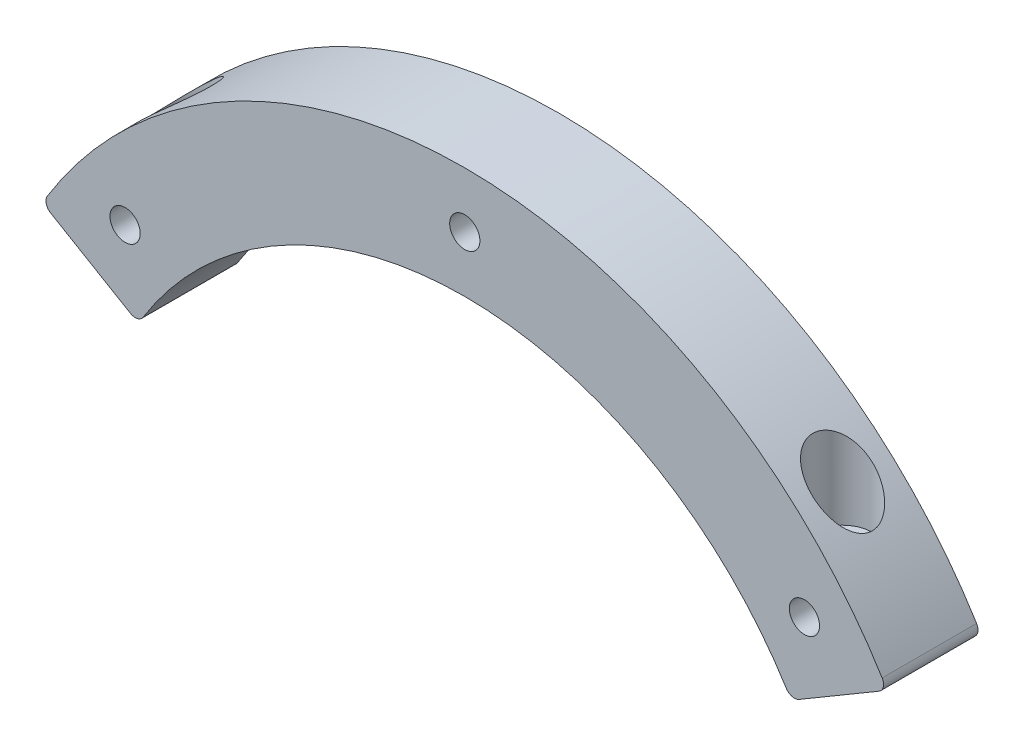
ISO-10303-21;
HEADER;
FILE_DESCRIPTION(('STEP AP214'),'2;1');
FILE_NAME('part.step','',(''),(''),'','','');
FILE_SCHEMA(('AUTOMOTIVE_DESIGN { 1 0 10303 214 1 1 1 1 }'));
ENDSEC;
DATA;
#1=APPLICATION_CONTEXT('core data for automotive mechanical design processes');
#2=APPLICATION_PROTOCOL_DEFINITION('international standard','automotive_design',2000,#1);
#3=PRODUCT_CONTEXT('',#1,'mechanical');
#4=PRODUCT('Part','Part','',(#3));
#5=PRODUCT_RELATED_PRODUCT_CATEGORY('part','',(#4));
#6=PRODUCT_DEFINITION_FORMATION('','',#4);
#7=PRODUCT_DEFINITION_CONTEXT('part definition',#1,'design');
#8=PRODUCT_DEFINITION('design','',#6,#7);
#9=PRODUCT_DEFINITION_SHAPE('','',#8);
#10=(LENGTH_UNIT() NAMED_UNIT(*) SI_UNIT(.MILLI.,.METRE.));
#11=(NAMED_UNIT(*) PLANE_ANGLE_UNIT() SI_UNIT($,.RADIAN.));
#12=(NAMED_UNIT(*) SI_UNIT($,.STERADIAN.) SOLID_ANGLE_UNIT());
#13=UNCERTAINTY_MEASURE_WITH_UNIT(LENGTH_MEASURE(1.E-05),#10,'distance_accuracy_value','');
#14=(GEOMETRIC_REPRESENTATION_CONTEXT(3) GLOBAL_UNCERTAINTY_ASSIGNED_CONTEXT((#13)) GLOBAL_UNIT_ASSIGNED_CONTEXT((#10,
#11,#12)) REPRESENTATION_CONTEXT('',''));
#15=CARTESIAN_POINT('',(0.,0.,0.));
#16=DIRECTION('',(0.,0.,1.));
#17=DIRECTION('',(1.,0.,0.));
#18=AXIS2_PLACEMENT_3D('',#15,#16,#17);
#19=CARTESIAN_POINT('',(0.,0.,10.));
#20=DIRECTION('',(0.,0.,-1.));
#21=DIRECTION('',(-1.,0.,0.));
#22=AXIS2_PLACEMENT_3D('',#19,#20,#21);
#23=CYLINDRICAL_SURFACE('',#22,40.1);
#24=CARTESIAN_POINT('',(0.,0.,0.));
#25=DIRECTION('',(0.,0.,-1.));
#26=DIRECTION('',(1.,0.,0.));
#27=AXIS2_PLACEMENT_3D('',#24,#25,#26);
#28=CIRCLE('',#27,40.1);
#29=CARTESIAN_POINT('',(-34.0459112545026,21.1869282070464,0.));
#30=VERTEX_POINT('',#29);
#31=CARTESIAN_POINT('',(34.0459112545025,21.1869282070464,0.));
#32=VERTEX_POINT('',#31);
#33=EDGE_CURVE('E141',#30,#32,#28,.T.);
#34=ORIENTED_EDGE('',*,*,#33,.T.);
#35=DIRECTION('',(0.,0.,-1.));
#36=VECTOR('',#35,1.);
#37=CARTESIAN_POINT('',(34.0459112545025,21.1869282070464,10.));
#38=LINE('',#37,#36);
#39=CARTESIAN_POINT('',(34.0459112545025,21.1869282070464,10.));
#40=VERTEX_POINT('',#39);
#41=EDGE_CURVE('E167',#32,#40,#38,.F.);
#42=ORIENTED_EDGE('',*,*,#41,.T.);
#43=CARTESIAN_POINT('',(0.,0.,10.));
#44=DIRECTION('',(0.,0.,-1.));
#45=DIRECTION('',(1.,0.,0.));
#46=AXIS2_PLACEMENT_3D('',#43,#44,#45);
#47=CIRCLE('',#46,40.1);
#48=CARTESIAN_POINT('',(-34.0459112545026,21.1869282070464,10.));
#49=VERTEX_POINT('',#48);
#50=EDGE_CURVE('E143',#49,#40,#47,.T.);
#51=ORIENTED_EDGE('',*,*,#50,.F.);
#52=DIRECTION('',(0.,0.,-1.));
#53=VECTOR('',#52,1.);
#54=CARTESIAN_POINT('',(-34.0459112545026,21.1869282070464,10.));
#55=LINE('',#54,#53);
#56=EDGE_CURVE('E162',#49,#30,#55,.T.);
#57=ORIENTED_EDGE('',*,*,#56,.T.);
#58=EDGE_LOOP('',(#34,#42,#51,#57));
#59=FACE_BOUND('',#58,.T.);
#60=ADVANCED_FACE('F41',(#59),#23,.F.);
#61=CARTESIAN_POINT('',(34.5513293337052,20.3522883547242,10.));
#62=DIRECTION('',(-0.507538362960701,0.861629160441527,0.));
#63=DIRECTION('',(-0.861629160441527,-0.507538362960701,0.));
#64=AXIS2_PLACEMENT_3D('',#61,#62,#63);
#65=PLANE('',#64);
#66=DIRECTION('',(0.861629160441527,0.507538362960701,0.));
#67=VECTOR('',#66,1.);
#68=CARTESIAN_POINT('',(34.5513293337052,20.3522883547242,0.));
#69=LINE('',#68,#67);
#70=CARTESIAN_POINT('',(35.40247483578,20.8536513709701,0.));
#71=VERTEX_POINT('',#70);
#72=CARTESIAN_POINT('',(43.8484595089165,25.8287165514455,0.));
#73=VERTEX_POINT('',#72);
#74=EDGE_CURVE('E139',#71,#73,#69,.T.);
#75=ORIENTED_EDGE('',*,*,#74,.T.);
#76=DIRECTION('',(0.,0.,-1.));
#77=VECTOR('',#76,1.);
#78=CARTESIAN_POINT('',(43.8484595089165,25.8287165514455,10.));
#79=LINE('',#78,#77);
#80=CARTESIAN_POINT('',(43.8484595089165,25.8287165514455,10.));
#81=VERTEX_POINT('',#80);
#82=EDGE_CURVE('E120',#73,#81,#79,.F.);
#83=ORIENTED_EDGE('',*,*,#82,.T.);
#84=DIRECTION('',(0.861629160441527,0.507538362960701,0.));
#85=VECTOR('',#84,1.);
#86=CARTESIAN_POINT('',(34.5513293337052,20.3522883547242,10.));
#87=LINE('',#86,#85);
#88=CARTESIAN_POINT('',(35.40247483578,20.8536513709701,10.));
#89=VERTEX_POINT('',#88);
#90=EDGE_CURVE('E242',#89,#81,#87,.T.);
#91=ORIENTED_EDGE('',*,*,#90,.F.);
#92=DIRECTION('',(0.,0.,-1.));
#93=VECTOR('',#92,1.);
#94=CARTESIAN_POINT('',(35.40247483578,20.8536513709701,10.));
#95=LINE('',#94,#93);
#96=EDGE_CURVE('E124',#89,#71,#95,.T.);
#97=ORIENTED_EDGE('',*,*,#96,.T.);
#98=EDGE_LOOP('',(#75,#83,#91,#97));
#99=FACE_BOUND('',#98,.T.);
#100=ADVANCED_FACE('F216',(#99),#65,.F.);
#101=CARTESIAN_POINT('',(0.,0.,10.));
#102=DIRECTION('',(0.,0.,-1.));
#103=DIRECTION('',(-1.,0.,0.));
#104=AXIS2_PLACEMENT_3D('',#101,#102,#103);
#105=CYLINDRICAL_SURFACE('',#104,51.9);
#106=CARTESIAN_POINT('',(-35.,38.3224477297576,8.15));
#107=CARTESIAN_POINT('',(-35.2406703512194,38.1026356229008,8.15000573117335));
#108=CARTESIAN_POINT('',(-35.4795567205825,37.8802552751689,8.12247647811956));
#109=CARTESIAN_POINT('',(-35.8294413464073,37.5484659032388,8.04119527155728));
#110=CARTESIAN_POINT('',(-35.9446859216642,37.4381427904591,8.00742542560775));
#111=CARTESIAN_POINT('',(-36.1716979785649,37.2188540229237,7.92645350767722));
#112=CARTESIAN_POINT('',(-36.283466370933,37.1098880171824,7.87925498732206));
#113=CARTESIAN_POINT('',(-36.5648332484608,36.8331491533699,7.74053460707915));
#114=CARTESIAN_POINT('',(-36.7313018583841,36.6670521814482,7.63905351506327));
#115=CARTESIAN_POINT('',(-37.0489636596545,36.3460454165649,7.40074735299531));
#116=CARTESIAN_POINT('',(-37.2001832429243,36.1911164321856,7.26398485820211));
#117=CARTESIAN_POINT('',(-37.4380081070151,35.9447555325065,6.99996399732091));
#118=CARTESIAN_POINT('',(-37.5302751845788,35.8483449877457,6.88247115133183));
#119=CARTESIAN_POINT('',(-37.7007513801221,35.6690140396576,6.62842065765867));
#120=CARTESIAN_POINT('',(-37.7789812053954,35.5860737828437,6.49189162916835));
#121=CARTESIAN_POINT('',(-37.9018682596199,35.4551077144567,6.23192191769808));
#122=CARTESIAN_POINT('',(-37.9501271471947,35.4034105237743,6.11204711513617));
#123=CARTESIAN_POINT('',(-38.0325423020939,35.3148611131333,5.86220372968106));
#124=CARTESIAN_POINT('',(-38.0667094687838,35.2779974206145,5.73224304060305));
#125=CARTESIAN_POINT('',(-38.1055793074567,35.2359926978498,5.53160716465714));
#126=CARTESIAN_POINT('',(-38.1164941184604,35.2241825439085,5.46344477525469));
#127=CARTESIAN_POINT('',(-38.1338594699113,35.2053821122058,5.32590941094171));
#128=CARTESIAN_POINT('',(-38.1403121976711,35.1983894729058,5.25653704628391));
#129=CARTESIAN_POINT('',(-38.1485918122328,35.1894157561752,5.1172093313565));
#130=CARTESIAN_POINT('',(-38.150419883429,35.187433395591,5.04725413495813));
#131=CARTESIAN_POINT('',(-38.1494172017403,35.1885203157563,4.90743914796108));
#132=CARTESIAN_POINT('',(-38.1465868853007,35.1915891232606,4.8375793490383));
#133=CARTESIAN_POINT('',(-38.1324874179171,35.2068688645954,4.64679131335652));
#134=CARTESIAN_POINT('',(-38.1165049092271,35.2241845193938,4.52655743819712));
#135=CARTESIAN_POINT('',(-38.0716349766767,35.2726759831111,4.29152682830348));
#136=CARTESIAN_POINT('',(-38.0427423129561,35.3038574197268,4.17673232219763));
#137=CARTESIAN_POINT('',(-37.9635662113478,35.3890083688011,3.92184186907));
#138=CARTESIAN_POINT('',(-37.9094876097072,35.4469860605981,3.78426486489153));
#139=CARTESIAN_POINT('',(-37.7864409107466,35.5781250304539,3.52382157061332));
#140=CARTESIAN_POINT('',(-37.717445698754,35.6513139492277,3.40098271156103));
#141=CARTESIAN_POINT('',(-37.5389487473158,35.8393622673162,3.12581187642174));
#142=CARTESIAN_POINT('',(-37.4241110848495,35.9593788628743,2.98049783016287));
#143=CARTESIAN_POINT('',(-37.1786713572102,36.2130871632198,2.71782876648964));
#144=CARTESIAN_POINT('',(-37.0480407467624,36.3468035614016,2.60052555114634));
#145=CARTESIAN_POINT('',(-36.81883342707,36.5786969186517,2.42551323842817));
#146=CARTESIAN_POINT('',(-36.7232835046072,36.6746437441084,2.3607183376849));
#147=CARTESIAN_POINT('',(-36.5277938476346,36.8693544251864,2.24294067472138));
#148=CARTESIAN_POINT('',(-36.4278526142487,36.968119238568,2.18996198378467));
#149=CARTESIAN_POINT('',(-36.2243614011626,37.1675388394519,2.09551609234908));
#150=CARTESIAN_POINT('',(-36.1208092142472,37.2681947649368,2.05405607661608));
#151=CARTESIAN_POINT('',(-35.9108802180804,37.4705215574185,1.98253566542664));
#152=CARTESIAN_POINT('',(-35.8045037095195,37.5721923156581,1.95247406160877));
#153=CARTESIAN_POINT('',(-35.4785106215701,37.8810704002147,1.87850250863184));
#154=CARTESIAN_POINT('',(-35.2552630468381,38.0889692964388,1.8522898385261));
#155=CARTESIAN_POINT('',(-34.8049632469072,38.5008778876968,1.84799803867863));
#156=CARTESIAN_POINT('',(-34.5779134443084,38.7048898944446,1.86988933674395));
#157=CARTESIAN_POINT('',(-34.1592447703961,39.0745737843129,1.95788525713533));
#158=CARTESIAN_POINT('',(-33.9672896703433,39.2414967416835,2.01707319545915));
#159=CARTESIAN_POINT('',(-33.5906735949968,39.5643507578163,2.17547841553032));
#160=CARTESIAN_POINT('',(-33.4060041641622,39.7202947339509,2.27464770023688));
#161=CARTESIAN_POINT('',(-33.0917054902524,39.9822598490737,2.48834050483102));
#162=CARTESIAN_POINT('',(-32.9590617377612,40.091604052291,2.59434491106679));
#163=CARTESIAN_POINT('',(-32.7076665439433,40.2969573047676,2.83260835189639));
#164=CARTESIAN_POINT('',(-32.5888974828253,40.392983296814,2.96483349931873));
#165=CARTESIAN_POINT('',(-32.391233729498,40.5515851260425,3.22833041473402));
#166=CARTESIAN_POINT('',(-32.3090187369673,40.6170668780506,3.35535849544709));
#167=CARTESIAN_POINT('',(-32.1617108038003,40.7338091618904,3.62517660795383));
#168=CARTESIAN_POINT('',(-32.0966113518096,40.7850751023248,3.76796061620257));
#169=CARTESIAN_POINT('',(-32.0145658461209,40.8494650378911,3.9919763612309));
#170=CARTESIAN_POINT('',(-31.9897478716829,40.8688977830838,4.06862717674282));
#171=CARTESIAN_POINT('',(-31.9458712114045,40.9032038926406,4.2245382947334));
#172=CARTESIAN_POINT('',(-31.9268096742363,40.9180795143308,4.30379728366231));
#173=CARTESIAN_POINT('',(-31.8948143658883,40.943024221682,4.46426501498333));
#174=CARTESIAN_POINT('',(-31.8818787092063,40.9530947863123,4.54547314934613));
#175=CARTESIAN_POINT('',(-31.8623791229937,40.9682674669344,4.70908072461026));
#176=CARTESIAN_POINT('',(-31.8558143701278,40.9733702249345,4.79148001017749));
#177=CARTESIAN_POINT('',(-31.8467269951494,40.9804356352794,5.01917656294126));
#178=CARTESIAN_POINT('',(-31.8509957229878,40.9771207760241,5.16500331502294));
#179=CARTESIAN_POINT('',(-31.8794270770301,40.9550048517253,5.4533830690638));
#180=CARTESIAN_POINT('',(-31.9035863455792,40.9362064004143,5.59593661938665));
#181=CARTESIAN_POINT('',(-31.9693381134039,40.8848759925512,5.86999683115994));
#182=CARTESIAN_POINT('',(-32.0104267737322,40.8527407679812,6.00170051199785));
#183=CARTESIAN_POINT('',(-32.1078235891291,40.7762367487645,6.2555148557032));
#184=CARTESIAN_POINT('',(-32.1641347950078,40.7318655018125,6.37762358927113));
#185=CARTESIAN_POINT('',(-32.295410888942,40.6278728191235,6.62129606472536));
#186=CARTESIAN_POINT('',(-32.3716295367866,40.5672117456391,6.74173578245975));
#187=CARTESIAN_POINT('',(-32.5361500493327,40.4353817267539,6.96761608953662));
#188=CARTESIAN_POINT('',(-32.6244597865557,40.3642059328028,7.07304681452312));
#189=CARTESIAN_POINT('',(-32.8527561353796,40.1788076225168,7.31308903919404));
#190=CARTESIAN_POINT('',(-32.997939976744,40.0597593347109,7.43907333805093));
#191=CARTESIAN_POINT('',(-33.3006803871387,39.8084630012172,7.65894484314081));
#192=CARTESIAN_POINT('',(-33.4582622059464,39.6761878611102,7.7527643469443));
#193=CARTESIAN_POINT('',(-33.8426497837454,39.3493367657867,7.94018540504742));
#194=CARTESIAN_POINT('',(-34.0727048645377,39.150415132051,8.01973510684421));
#195=CARTESIAN_POINT('',(-34.4198359597814,38.844679267785,8.09839486159629));
#196=CARTESIAN_POINT('',(-34.5360347402964,38.7414076085257,8.11783606727678));
#197=CARTESIAN_POINT('',(-34.7682929803934,38.5331040960982,8.14363660952023));
#198=CARTESIAN_POINT('',(-34.8843524526742,38.4280724188882,8.14999724604157));
#199=CARTESIAN_POINT('',(-35.,38.3224477297576,8.15));
#200=B_SPLINE_CURVE_WITH_KNOTS('',3,(#106,#107,#108,#109,#110,#111,#112,#113,#114,#115,#116,
#117,#118,#119,#120,#121,#122,#123,#124,#125,#126,#127,#128,#129,#130,#131,#132,#133,#134,#135,
#136,#137,#138,#139,#140,#141,#142,#143,#144,#145,#146,#147,#148,#149,#150,#151,#152,#153,#154,
#155,#156,#157,#158,#159,#160,#161,#162,#163,#164,#165,#166,#167,#168,#169,#170,#171,#172,#173,
#174,#175,#176,#177,#178,#179,#180,#181,#182,#183,#184,#185,#186,#187,#188,#189,#190,#191,#192,
#193,#194,#195,#196,#197,#198,#199),.UNSPECIFIED.,.T.,.F.,(4,2,2,2,2,2,2,2,2,2,2,2,2,2,2,2,2,2,
2,2,2,2,2,2,2,2,2,2,2,2,2,2,2,2,2,2,2,2,2,2,2,2,2,2,2,2,4),(0.,0.977122519277706,
1.46589386997437,1.95453607003518,2.7201478188973,3.48441090068184,4.016174809118,
4.54714770970252,4.96316400294988,5.37885791855113,5.58869049052064,5.79842012953748,
6.00809605045705,6.21775232790884,6.58346961464795,6.94933547052032,7.42307029332304,
7.89767359862547,8.55619644838571,9.21592787127235,9.66573499172205,10.1156968549376,
10.5659387546437,11.0161329102288,11.9306699399741,12.8446449100825,13.6252715806697,
14.4049638972591,15.0086546183889,15.6115701673184,16.104278470854,16.5967990586756,
16.8451297266578,17.0933371868533,17.3414682008383,17.5895671436656,18.0249357686638,
18.4602309156225,18.883412712732,19.3066793843288,19.7696220674988,20.2328676193998,
20.9074277644013,21.5833991708159,22.5201931026355,22.9897692431847,23.4592987145913),.UNSPECIFIED.);
#201=CARTESIAN_POINT('',(-35.,38.3224477297576,8.15));
#202=VERTEX_POINT('',#201);
#203=EDGE_CURVE('E44',#202,#202,#200,.T.);
#204=ORIENTED_EDGE('',*,*,#203,.T.);
#205=EDGE_LOOP('',(#204));
#206=FACE_BOUND('',#205,.T.);
#207=CARTESIAN_POINT('',(35.,38.3224477297576,8.14999999999999));
#208=CARTESIAN_POINT('',(34.8036015358661,38.5018166911898,8.15000352676968));
#209=CARTESIAN_POINT('',(34.6056634433254,38.6798076977788,8.13166676269856));
#210=CARTESIAN_POINT('',(34.2109356602648,39.029366070842,8.05618927642139));
#211=CARTESIAN_POINT('',(34.0141475945639,39.2009256346073,7.9990029328034));
#212=CARTESIAN_POINT('',(33.6528052744921,39.5113641471338,7.85314413256149));
#213=CARTESIAN_POINT('',(33.4873864969767,39.6515921221974,7.76953169693498));
#214=CARTESIAN_POINT('',(33.1672218299202,39.919779546928,7.56885333994523));
#215=CARTESIAN_POINT('',(33.0124607119714,40.0477566081006,7.45183643426331));
#216=CARTESIAN_POINT('',(32.7509788602999,40.2617165598512,7.21112927540978));
#217=CARTESIAN_POINT('',(32.6409591777618,40.350898906384,7.09388246238738));
#218=CARTESIAN_POINT('',(32.4365441764047,40.5154015981846,6.83791444770733));
#219=CARTESIAN_POINT('',(32.3421319576516,40.5907369471582,6.69921679256445));
#220=CARTESIAN_POINT('',(32.1874615901376,40.713456198771,6.42574431576159));
#221=CARTESIAN_POINT('',(32.1241613389853,40.7633783226289,6.2938371581117));
#222=CARTESIAN_POINT('',(32.0154993660171,40.8487771730165,6.01839626055996));
#223=CARTESIAN_POINT('',(31.9701297410983,40.8842602638993,5.8748676766038));
#224=CARTESIAN_POINT('',(31.8999375745152,40.9390524381234,5.57906688260347));
#225=CARTESIAN_POINT('',(31.8752163794769,40.9582817501253,5.42675542296718));
#226=CARTESIAN_POINT('',(31.8484637742963,40.9790881591166,5.11896355678535));
#227=CARTESIAN_POINT('',(31.8464249752957,40.9806710044957,4.96348419872746));
#228=CARTESIAN_POINT('',(31.8643432812224,40.9667390577936,4.66809412099523));
#229=CARTESIAN_POINT('',(31.8824254209223,40.9526817093272,4.52799359681695));
#230=CARTESIAN_POINT('',(31.9365291998498,40.9105031247182,4.25353275947049));
#231=CARTESIAN_POINT('',(31.9725510631105,40.8823817129421,4.1191725180103));
#232=CARTESIAN_POINT('',(32.061416066582,40.8127286283481,3.85685636289747));
#233=CARTESIAN_POINT('',(32.1145660916293,40.7709520852,3.72907084746508));
#234=CARTESIAN_POINT('',(32.2349058742554,40.675873867222,3.48497636198482));
#235=CARTESIAN_POINT('',(32.3021000125115,40.6225685961397,3.36867098955854));
#236=CARTESIAN_POINT('',(32.4572150498144,40.4987679513171,3.13483023335744));
#237=CARTESIAN_POINT('',(32.5466866070168,40.4269470618774,3.01903125674525));
#238=CARTESIAN_POINT('',(32.736664018953,40.2732644071253,2.80446078275238));
#239=CARTESIAN_POINT('',(32.8371779973973,40.1913952442189,2.70570196067361));
#240=CARTESIAN_POINT('',(33.0977455819581,39.9773648015662,2.48080162851728));
#241=CARTESIAN_POINT('',(33.2627772077739,39.8402655848361,2.36506658415247));
#242=CARTESIAN_POINT('',(33.6031473060487,39.55361415611,2.16981023202638));
#243=CARTESIAN_POINT('',(33.7785061019207,39.404037130011,2.09036322192202));
#244=CARTESIAN_POINT('',(34.179106474274,39.0574582684918,1.94969409270766));
#245=CARTESIAN_POINT('',(34.40572227625,38.8580479353494,1.89820058775788));
#246=CARTESIAN_POINT('',(34.7450645097148,38.5540384004047,1.85826303223056));
#247=CARTESIAN_POINT('',(34.8581692733253,38.4518049277646,1.85117665585714));
#248=CARTESIAN_POINT('',(35.0835385757241,38.246288289456,1.84909303049168));
#249=CARTESIAN_POINT('',(35.1958030844615,38.1430050865533,1.85409621181859));
#250=CARTESIAN_POINT('',(35.5325586868311,37.8304272719317,1.88710531913722));
#251=CARTESIAN_POINT('',(35.7548817939416,37.6203126587353,1.93335107403945));
#252=CARTESIAN_POINT('',(36.0792740570779,37.3084271480538,2.03848224768344));
#253=CARTESIAN_POINT('',(36.1859093910686,37.2049931247504,2.07949792526275));
#254=CARTESIAN_POINT('',(36.3955251122647,36.9999620027033,2.17365981913181));
#255=CARTESIAN_POINT('',(36.4985064513571,36.8983644289876,2.22680284896656));
#256=CARTESIAN_POINT('',(36.7548685066983,36.6433853380027,2.37786214155588));
#257=CARTESIAN_POINT('',(36.9051825685758,36.4919073885792,2.48440640734785));
#258=CARTESIAN_POINT('',(37.190877699613,36.2006909503872,2.72891515691601));
#259=CARTESIAN_POINT('',(37.326282832576,36.0609336334628,2.8668278734193));
#260=CARTESIAN_POINT('',(37.5400763267446,35.8380986488617,3.13169510025289));
#261=CARTESIAN_POINT('',(37.623671340296,35.7502701119248,3.25042179863073));
#262=CARTESIAN_POINT('',(37.7767342920394,35.5884909554264,3.50525713168394));
#263=CARTESIAN_POINT('',(37.8462229093553,35.5145200339038,3.64133983960133));
#264=CARTESIAN_POINT('',(37.9543620719837,35.3988892748614,3.90015460083747));
#265=CARTESIAN_POINT('',(37.9964157567733,35.3537129541922,4.01987517932691));
#266=CARTESIAN_POINT('',(38.0664422798947,35.2783026426553,4.26788871108591));
#267=CARTESIAN_POINT('',(38.0944264391808,35.2480566385606,4.39617467780229));
#268=CARTESIAN_POINT('',(38.1343283290446,35.2048847265458,4.65904254463947));
#269=CARTESIAN_POINT('',(38.146138917895,35.1920743240495,4.79366037737975));
#270=CARTESIAN_POINT('',(38.1522472730949,35.1854523776217,5.06375140851203));
#271=CARTESIAN_POINT('',(38.14655003923,35.1916354096518,5.19922435167981));
#272=CARTESIAN_POINT('',(38.1196727798968,35.2207446885088,5.45241435990684));
#273=CARTESIAN_POINT('',(38.1001441522145,35.2418848682001,5.57052533991842));
#274=CARTESIAN_POINT('',(38.0487968450995,35.2973154744713,5.8007968789767));
#275=CARTESIAN_POINT('',(38.0169729988649,35.3316114294401,5.91295491385915));
#276=CARTESIAN_POINT('',(37.9298003808386,35.425211198259,6.16730334077631));
#277=CARTESIAN_POINT('',(37.8701180127205,35.4890651248315,6.30632961511725));
#278=CARTESIAN_POINT('',(37.7357546071564,35.6319024271186,6.56842124830814));
#279=CARTESIAN_POINT('',(37.6610447940277,35.7109148157748,6.69145522824762));
#280=CARTESIAN_POINT('',(37.4681963370556,35.9133769620988,6.96695838265036));
#281=CARTESIAN_POINT('',(37.3445856922256,36.0420218494871,7.11174654963805));
#282=CARTESIAN_POINT('',(37.0815094344476,36.3126349796666,7.37152037099813));
#283=CARTESIAN_POINT('',(36.9420093585354,36.4546320614305,7.48643940054448));
#284=CARTESIAN_POINT('',(36.6994263819875,36.698518576133,7.65489848110273));
#285=CARTESIAN_POINT('',(36.599442409565,36.7982522481807,7.71619825629573));
#286=CARTESIAN_POINT('',(36.3952697756981,37.000202973059,7.82651758869624));
#287=CARTESIAN_POINT('',(36.2910793804329,37.1024210428657,7.87553202082132));
#288=CARTESIAN_POINT('',(35.9737541948947,37.4110338754071,8.00439044575301));
#289=CARTESIAN_POINT('',(35.7553721037099,37.6198847160674,8.06638347314588));
#290=CARTESIAN_POINT('',(35.4454160812366,37.9110433015586,8.11962283185387));
#291=CARTESIAN_POINT('',(35.3569489550767,37.9935637296113,8.13098322044248));
#292=CARTESIAN_POINT('',(35.1790948530161,38.1583011452109,8.14617035723585));
#293=CARTESIAN_POINT('',(35.0897080364581,38.2405181820771,8.14999838909338));
#294=CARTESIAN_POINT('',(35.,38.3224477297576,8.14999999999999));
#295=B_SPLINE_CURVE_WITH_KNOTS('',3,(#207,#208,#209,#210,#211,#212,#213,#214,#215,#216,#217,
#218,#219,#220,#221,#222,#223,#224,#225,#226,#227,#228,#229,#230,#231,#232,#233,#234,#235,#236,
#237,#238,#239,#240,#241,#242,#243,#244,#245,#246,#247,#248,#249,#250,#251,#252,#253,#254,#255,
#256,#257,#258,#259,#260,#261,#262,#263,#264,#265,#266,#267,#268,#269,#270,#271,#272,#273,#274,
#275,#276,#277,#278,#279,#280,#281,#282,#283,#284,#285,#286,#287,#288,#289,#290,#291,#292,#293,
#294),.UNSPECIFIED.,.T.,.F.,(4,2,2,2,2,2,2,2,2,2,2,2,2,2,2,2,2,2,2,2,2,2,2,2,2,2,2,2,2,2,2,2,2,
2,2,2,2,2,2,2,2,2,2,4),(0.,0.7976067121281,1.5961516837715,2.29087931291462,2.98459273529965,
3.53410447152713,4.08301723666877,4.5448583276355,5.00649562989344,5.47038564321726,
5.93412453855603,6.35801624402291,6.78191324322506,7.21387208934795,7.64596587484509,
8.13319027784262,8.62077555425877,9.34806261524171,10.0768321521697,10.990384135111,
11.4478711413519,11.905374431748,12.828899993972,13.2908436247775,13.7526660196194,
14.4657799425771,15.1777254461447,15.6852060595191,16.1919372776423,16.5944373755454,
16.9966130838868,17.4014403209437,17.806151960461,18.169269951674,18.5325407016972,
19.0224757869074,19.5133581242308,20.1989445544666,20.886047349373,21.3473348681917,
21.8088145034548,22.7294723605121,23.0938536666434,23.4581728700871),.UNSPECIFIED.);
#296=CARTESIAN_POINT('',(35.,38.3224477297576,8.14999999999999));
#297=VERTEX_POINT('',#296);
#298=EDGE_CURVE('E166',#297,#297,#295,.T.);
#299=ORIENTED_EDGE('',*,*,#298,.T.);
#300=EDGE_LOOP('',(#299));
#301=FACE_BOUND('',#300,.T.);
#302=CARTESIAN_POINT('',(0.,0.,10.));
#303=DIRECTION('',(0.,0.,1.));
#304=DIRECTION('',(1.,0.,0.));
#305=AXIS2_PLACEMENT_3D('',#302,#303,#304);
#306=CIRCLE('',#305,51.9);
#307=CARTESIAN_POINT('',(44.1924127205325,27.2147139969928,10.));
#308=VERTEX_POINT('',#307);
#309=CARTESIAN_POINT('',(-44.1924127205325,27.2147139969928,10.));
#310=VERTEX_POINT('',#309);
#311=EDGE_CURVE('E135',#308,#310,#306,.T.);
#312=ORIENTED_EDGE('',*,*,#311,.F.);
#313=DIRECTION('',(0.,0.,-1.));
#314=VECTOR('',#313,1.);
#315=CARTESIAN_POINT('',(44.1924127205325,27.2147139969928,10.));
#316=LINE('',#315,#314);
#317=CARTESIAN_POINT('',(44.1924127205325,27.2147139969928,0.));
#318=VERTEX_POINT('',#317);
#319=EDGE_CURVE('E119',#308,#318,#316,.T.);
#320=ORIENTED_EDGE('',*,*,#319,.T.);
#321=CARTESIAN_POINT('',(0.,0.,0.));
#322=DIRECTION('',(0.,0.,1.));
#323=DIRECTION('',(1.,0.,0.));
#324=AXIS2_PLACEMENT_3D('',#321,#322,#323);
#325=CIRCLE('',#324,51.9);
#326=CARTESIAN_POINT('',(-44.1924127205325,27.2147139969928,0.));
#327=VERTEX_POINT('',#326);
#328=EDGE_CURVE('E128',#318,#327,#325,.T.);
#329=ORIENTED_EDGE('',*,*,#328,.T.);
#330=DIRECTION('',(0.,0.,-1.));
#331=VECTOR('',#330,1.);
#332=CARTESIAN_POINT('',(-44.1924127205325,27.2147139969928,10.));
#333=LINE('',#332,#331);
#334=EDGE_CURVE('E134',#327,#310,#333,.F.);
#335=ORIENTED_EDGE('',*,*,#334,.T.);
#336=EDGE_LOOP('',(#312,#320,#329,#335));
#337=FACE_BOUND('',#336,.T.);
#338=ADVANCED_FACE('F129',(#206,#301,#337),#105,.T.);
#339=CARTESIAN_POINT('',(-34.5513293337052,20.3522883547242,10.));
#340=DIRECTION('',(0.507538362960703,0.861629160441526,0.));
#341=DIRECTION('',(-0.861629160441526,0.507538362960703,0.));
#342=AXIS2_PLACEMENT_3D('',#339,#340,#341);
#343=PLANE('',#342);
#344=DIRECTION('',(0.861629160441526,-0.507538362960703,0.));
#345=VECTOR('',#344,1.);
#346=CARTESIAN_POINT('',(-34.5513293337052,20.3522883547242,0.));
#347=LINE('',#346,#345);
#348=CARTESIAN_POINT('',(-43.8484595089165,25.8287165514455,0.));
#349=VERTEX_POINT('',#348);
#350=CARTESIAN_POINT('',(-35.40247483578,20.8536513709701,0.));
#351=VERTEX_POINT('',#350);
#352=EDGE_CURVE('E138',#349,#351,#347,.T.);
#353=ORIENTED_EDGE('',*,*,#352,.T.);
#354=DIRECTION('',(0.,0.,-1.));
#355=VECTOR('',#354,1.);
#356=CARTESIAN_POINT('',(-35.40247483578,20.8536513709701,10.));
#357=LINE('',#356,#355);
#358=CARTESIAN_POINT('',(-35.40247483578,20.8536513709701,10.));
#359=VERTEX_POINT('',#358);
#360=EDGE_CURVE('E11',#351,#359,#357,.F.);
#361=ORIENTED_EDGE('',*,*,#360,.T.);
#362=DIRECTION('',(0.861629160441526,-0.507538362960703,0.));
#363=VECTOR('',#362,1.);
#364=CARTESIAN_POINT('',(-34.5513293337052,20.3522883547242,10.));
#365=LINE('',#364,#363);
#366=CARTESIAN_POINT('',(-43.8484595089165,25.8287165514455,10.));
#367=VERTEX_POINT('',#366);
#368=EDGE_CURVE('E150',#367,#359,#365,.T.);
#369=ORIENTED_EDGE('',*,*,#368,.F.);
#370=DIRECTION('',(0.,0.,-1.));
#371=VECTOR('',#370,1.);
#372=CARTESIAN_POINT('',(-43.8484595089165,25.8287165514455,10.));
#373=LINE('',#372,#371);
#374=EDGE_CURVE('E54',#367,#349,#373,.T.);
#375=ORIENTED_EDGE('',*,*,#374,.T.);
#376=EDGE_LOOP('',(#353,#361,#369,#375));
#377=FACE_BOUND('',#376,.T.);
#378=ADVANCED_FACE('F206',(#377),#343,.F.);
#379=CARTESIAN_POINT('',(0.,0.,10.));
#380=DIRECTION('',(0.,0.,1.));
#381=DIRECTION('',(1.,0.,0.));
#382=AXIS2_PLACEMENT_3D('',#379,#380,#381);
#383=PLANE('',#382);
#384=CARTESIAN_POINT('',(0.,46.,10.));
#385=DIRECTION('',(0.,0.,1.));
#386=DIRECTION('',(1.,0.,0.));
#387=AXIS2_PLACEMENT_3D('',#384,#385,#386);
#388=CIRCLE('',#387,1.6);
#389=CARTESIAN_POINT('',(1.6,46.,10.));
#390=VERTEX_POINT('',#389);
#391=EDGE_CURVE('E254',#390,#390,#388,.T.);
#392=ORIENTED_EDGE('',*,*,#391,.F.);
#393=EDGE_LOOP('',(#392));
#394=FACE_BOUND('',#393,.T.);
#395=CARTESIAN_POINT('',(35.9642481935294,28.6805308855017,10.));
#396=DIRECTION('',(0.,0.,1.));
#397=DIRECTION('',(1.,0.,0.));
#398=AXIS2_PLACEMENT_3D('',#395,#396,#397);
#399=CIRCLE('',#398,1.6);
#400=CARTESIAN_POINT('',(37.5642481935294,28.6805308855017,10.));
#401=VERTEX_POINT('',#400);
#402=EDGE_CURVE('E259',#401,#401,#399,.T.);
#403=ORIENTED_EDGE('',*,*,#402,.F.);
#404=EDGE_LOOP('',(#403));
#405=FACE_BOUND('',#404,.T.);
#406=CARTESIAN_POINT('',(-35.964248193529,28.6805308855022,10.));
#407=DIRECTION('',(0.,0.,1.));
#408=DIRECTION('',(1.,0.,0.));
#409=AXIS2_PLACEMENT_3D('',#406,#407,#408);
#410=CIRCLE('',#409,1.6);
#411=CARTESIAN_POINT('',(-34.364248193529,28.6805308855022,10.));
#412=VERTEX_POINT('',#411);
#413=EDGE_CURVE('E267',#412,#412,#410,.T.);
#414=ORIENTED_EDGE('',*,*,#413,.F.);
#415=EDGE_LOOP('',(#414));
#416=FACE_BOUND('',#415,.T.);
#417=ORIENTED_EDGE('',*,*,#90,.T.);
#418=CARTESIAN_POINT('',(43.3409211459558,26.690345711887,10.));
#419=DIRECTION('',(0.,0.,1.));
#420=DIRECTION('',(1.,0.,0.));
#421=AXIS2_PLACEMENT_3D('',#418,#419,#420);
#422=CIRCLE('',#421,1.);
#423=EDGE_CURVE('E161',#81,#308,#422,.T.);
#424=ORIENTED_EDGE('',*,*,#423,.T.);
#425=ORIENTED_EDGE('',*,*,#311,.T.);
#426=CARTESIAN_POINT('',(-43.3409211459558,26.690345711887,10.));
#427=DIRECTION('',(0.,0.,1.));
#428=DIRECTION('',(1.,0.,0.));
#429=AXIS2_PLACEMENT_3D('',#426,#427,#428);
#430=CIRCLE('',#429,1.);
#431=EDGE_CURVE('E69',#310,#367,#430,.T.);
#432=ORIENTED_EDGE('',*,*,#431,.T.);
#433=ORIENTED_EDGE('',*,*,#368,.T.);
#434=CARTESIAN_POINT('',(-34.8949364728193,21.7152805314116,10.));
#435=DIRECTION('',(0.,0.,1.));
#436=DIRECTION('',(1.,0.,0.));
#437=AXIS2_PLACEMENT_3D('',#434,#435,#436);
#438=CIRCLE('',#437,1.);
#439=EDGE_CURVE('E160',#359,#49,#438,.T.);
#440=ORIENTED_EDGE('',*,*,#439,.T.);
#441=ORIENTED_EDGE('',*,*,#50,.T.);
#442=CARTESIAN_POINT('',(34.8949364728193,21.7152805314116,10.));
#443=DIRECTION('',(0.,0.,1.));
#444=DIRECTION('',(1.,0.,0.));
#445=AXIS2_PLACEMENT_3D('',#442,#443,#444);
#446=CIRCLE('',#445,1.);
#447=EDGE_CURVE('E157',#40,#89,#446,.T.);
#448=ORIENTED_EDGE('',*,*,#447,.T.);
#449=EDGE_LOOP('',(#417,#424,#425,#432,#433,#440,#441,#448));
#450=FACE_BOUND('',#449,.T.);
#451=ADVANCED_FACE('F201',(#394,#405,#416,#450),#383,.T.);
#452=CARTESIAN_POINT('',(0.,0.,0.));
#453=DIRECTION('',(0.,0.,1.));
#454=DIRECTION('',(1.,0.,0.));
#455=AXIS2_PLACEMENT_3D('',#452,#453,#454);
#456=PLANE('',#455);
#457=CARTESIAN_POINT('',(0.,46.,0.));
#458=DIRECTION('',(0.,0.,1.));
#459=DIRECTION('',(1.,0.,0.));
#460=AXIS2_PLACEMENT_3D('',#457,#458,#459);
#461=CIRCLE('',#460,1.6);
#462=CARTESIAN_POINT('',(1.6,46.,0.));
#463=VERTEX_POINT('',#462);
#464=EDGE_CURVE('E251',#463,#463,#461,.T.);
#465=ORIENTED_EDGE('',*,*,#464,.T.);
#466=EDGE_LOOP('',(#465));
#467=FACE_BOUND('',#466,.T.);
#468=CARTESIAN_POINT('',(35.9642481935294,28.6805308855017,0.));
#469=DIRECTION('',(0.,0.,1.));
#470=DIRECTION('',(1.,0.,0.));
#471=AXIS2_PLACEMENT_3D('',#468,#469,#470);
#472=CIRCLE('',#471,1.6);
#473=CARTESIAN_POINT('',(37.5642481935294,28.6805308855017,0.));
#474=VERTEX_POINT('',#473);
#475=EDGE_CURVE('E270',#474,#474,#472,.T.);
#476=ORIENTED_EDGE('',*,*,#475,.T.);
#477=EDGE_LOOP('',(#476));
#478=FACE_BOUND('',#477,.T.);
#479=CARTESIAN_POINT('',(-35.964248193529,28.6805308855022,0.));
#480=DIRECTION('',(0.,0.,1.));
#481=DIRECTION('',(1.,0.,0.));
#482=AXIS2_PLACEMENT_3D('',#479,#480,#481);
#483=CIRCLE('',#482,1.6);
#484=CARTESIAN_POINT('',(-34.364248193529,28.6805308855022,0.));
#485=VERTEX_POINT('',#484);
#486=EDGE_CURVE('E249',#485,#485,#483,.T.);
#487=ORIENTED_EDGE('',*,*,#486,.T.);
#488=EDGE_LOOP('',(#487));
#489=FACE_BOUND('',#488,.T.);
#490=ORIENTED_EDGE('',*,*,#328,.F.);
#491=CARTESIAN_POINT('',(43.3409211459558,26.690345711887,0.));
#492=DIRECTION('',(0.,0.,1.));
#493=DIRECTION('',(1.,0.,0.));
#494=AXIS2_PLACEMENT_3D('',#491,#492,#493);
#495=CIRCLE('',#494,1.);
#496=EDGE_CURVE('E114',#318,#73,#495,.F.);
#497=ORIENTED_EDGE('',*,*,#496,.T.);
#498=ORIENTED_EDGE('',*,*,#74,.F.);
#499=CARTESIAN_POINT('',(34.8949364728193,21.7152805314116,0.));
#500=DIRECTION('',(0.,0.,1.));
#501=DIRECTION('',(1.,0.,0.));
#502=AXIS2_PLACEMENT_3D('',#499,#500,#501);
#503=CIRCLE('',#502,1.);
#504=EDGE_CURVE('E123',#71,#32,#503,.F.);
#505=ORIENTED_EDGE('',*,*,#504,.T.);
#506=ORIENTED_EDGE('',*,*,#33,.F.);
#507=CARTESIAN_POINT('',(-34.8949364728193,21.7152805314116,0.));
#508=DIRECTION('',(0.,0.,1.));
#509=DIRECTION('',(1.,0.,0.));
#510=AXIS2_PLACEMENT_3D('',#507,#508,#509);
#511=CIRCLE('',#510,1.);
#512=EDGE_CURVE('E147',#30,#351,#511,.F.);
#513=ORIENTED_EDGE('',*,*,#512,.T.);
#514=ORIENTED_EDGE('',*,*,#352,.F.);
#515=CARTESIAN_POINT('',(-43.3409211459558,26.690345711887,0.));
#516=DIRECTION('',(0.,0.,1.));
#517=DIRECTION('',(1.,0.,0.));
#518=AXIS2_PLACEMENT_3D('',#515,#516,#517);
#519=CIRCLE('',#518,1.);
#520=EDGE_CURVE('E131',#349,#327,#519,.F.);
#521=ORIENTED_EDGE('',*,*,#520,.T.);
#522=EDGE_LOOP('',(#490,#497,#498,#505,#506,#513,#514,#521));
#523=FACE_BOUND('',#522,.T.);
#524=ADVANCED_FACE('F137',(#467,#478,#489,#523),#456,.F.);
#525=CARTESIAN_POINT('',(43.3409211459558,26.690345711887,10.));
#526=DIRECTION('',(0.,0.,-1.));
#527=DIRECTION('',(-1.,0.,0.));
#528=AXIS2_PLACEMENT_3D('',#525,#526,#527);
#529=CYLINDRICAL_SURFACE('',#528,1.);
#530=ORIENTED_EDGE('',*,*,#423,.F.);
#531=ORIENTED_EDGE('',*,*,#82,.F.);
#532=ORIENTED_EDGE('',*,*,#496,.F.);
#533=ORIENTED_EDGE('',*,*,#319,.F.);
#534=EDGE_LOOP('',(#530,#531,#532,#533));
#535=FACE_BOUND('',#534,.T.);
#536=ADVANCED_FACE('F117',(#535),#529,.T.);
#537=CARTESIAN_POINT('',(34.8949364728193,21.7152805314116,10.));
#538=DIRECTION('',(0.,0.,-1.));
#539=DIRECTION('',(-1.,0.,0.));
#540=AXIS2_PLACEMENT_3D('',#537,#538,#539);
#541=CYLINDRICAL_SURFACE('',#540,1.);
#542=ORIENTED_EDGE('',*,*,#447,.F.);
#543=ORIENTED_EDGE('',*,*,#41,.F.);
#544=ORIENTED_EDGE('',*,*,#504,.F.);
#545=ORIENTED_EDGE('',*,*,#96,.F.);
#546=EDGE_LOOP('',(#542,#543,#544,#545));
#547=FACE_BOUND('',#546,.T.);
#548=ADVANCED_FACE('F229',(#547),#541,.T.);
#549=CARTESIAN_POINT('',(-34.8949364728193,21.7152805314116,10.));
#550=DIRECTION('',(0.,0.,-1.));
#551=DIRECTION('',(-1.,0.,0.));
#552=AXIS2_PLACEMENT_3D('',#549,#550,#551);
#553=CYLINDRICAL_SURFACE('',#552,1.);
#554=ORIENTED_EDGE('',*,*,#439,.F.);
#555=ORIENTED_EDGE('',*,*,#360,.F.);
#556=ORIENTED_EDGE('',*,*,#512,.F.);
#557=ORIENTED_EDGE('',*,*,#56,.F.);
#558=EDGE_LOOP('',(#554,#555,#556,#557));
#559=FACE_BOUND('',#558,.T.);
#560=ADVANCED_FACE('F226',(#559),#553,.T.);
#561=CARTESIAN_POINT('',(-43.3409211459558,26.690345711887,10.));
#562=DIRECTION('',(0.,0.,-1.));
#563=DIRECTION('',(-1.,0.,0.));
#564=AXIS2_PLACEMENT_3D('',#561,#562,#563);
#565=CYLINDRICAL_SURFACE('',#564,1.);
#566=ORIENTED_EDGE('',*,*,#431,.F.);
#567=ORIENTED_EDGE('',*,*,#334,.F.);
#568=ORIENTED_EDGE('',*,*,#520,.F.);
#569=ORIENTED_EDGE('',*,*,#374,.F.);
#570=EDGE_LOOP('',(#566,#567,#568,#569));
#571=FACE_BOUND('',#570,.T.);
#572=ADVANCED_FACE('F43',(#571),#565,.T.);
#573=CARTESIAN_POINT('',(-35.964248193529,28.6805308855022,0.));
#574=DIRECTION('',(0.,0.,1.));
#575=DIRECTION('',(1.,0.,0.));
#576=AXIS2_PLACEMENT_3D('',#573,#574,#575);
#577=CYLINDRICAL_SURFACE('',#576,1.6);
#578=ORIENTED_EDGE('',*,*,#486,.F.);
#579=EDGE_LOOP('',(#578));
#580=FACE_BOUND('',#579,.T.);
#581=ORIENTED_EDGE('',*,*,#413,.T.);
#582=EDGE_LOOP('',(#581));
#583=FACE_BOUND('',#582,.T.);
#584=ADVANCED_FACE('F196',(#580,#583),#577,.F.);
#585=CARTESIAN_POINT('',(35.9642481935294,28.6805308855017,0.));
#586=DIRECTION('',(0.,0.,1.));
#587=DIRECTION('',(1.,0.,0.));
#588=AXIS2_PLACEMENT_3D('',#585,#586,#587);
#589=CYLINDRICAL_SURFACE('',#588,1.6);
#590=ORIENTED_EDGE('',*,*,#475,.F.);
#591=EDGE_LOOP('',(#590));
#592=FACE_BOUND('',#591,.T.);
#593=ORIENTED_EDGE('',*,*,#402,.T.);
#594=EDGE_LOOP('',(#593));
#595=FACE_BOUND('',#594,.T.);
#596=ADVANCED_FACE('F194',(#592,#595),#589,.F.);
#597=CARTESIAN_POINT('',(0.,46.,0.));
#598=DIRECTION('',(0.,0.,1.));
#599=DIRECTION('',(1.,0.,0.));
#600=AXIS2_PLACEMENT_3D('',#597,#598,#599);
#601=CYLINDRICAL_SURFACE('',#600,1.6);
#602=ORIENTED_EDGE('',*,*,#464,.F.);
#603=EDGE_LOOP('',(#602));
#604=FACE_BOUND('',#603,.T.);
#605=ORIENTED_EDGE('',*,*,#391,.T.);
#606=EDGE_LOOP('',(#605));
#607=FACE_BOUND('',#606,.T.);
#608=ADVANCED_FACE('F184',(#604,#607),#601,.F.);
#609=CARTESIAN_POINT('',(35.,31.9,4.99999999999999));
#610=DIRECTION('',(0.,1.,0.));
#611=DIRECTION('',(0.,0.,1.));
#612=AXIS2_PLACEMENT_3D('',#609,#610,#611);
#613=CYLINDRICAL_SURFACE('',#612,3.15);
#614=CARTESIAN_POINT('',(35.,31.9,4.99999999999999));
#615=DIRECTION('',(0.,1.,0.));
#616=DIRECTION('',(0.,0.,1.));
#617=AXIS2_PLACEMENT_3D('',#614,#615,#616);
#618=CIRCLE('',#617,3.15);
#619=CARTESIAN_POINT('',(35.,31.9,8.14999999999999));
#620=VERTEX_POINT('',#619);
#621=EDGE_CURVE('E265',#620,#620,#618,.T.);
#622=ORIENTED_EDGE('',*,*,#621,.F.);
#623=EDGE_LOOP('',(#622));
#624=FACE_BOUND('',#623,.T.);
#625=ORIENTED_EDGE('',*,*,#298,.F.);
#626=EDGE_LOOP('',(#625));
#627=FACE_BOUND('',#626,.T.);
#628=ADVANCED_FACE('F178',(#624,#627),#613,.F.);
#629=CARTESIAN_POINT('',(35.,31.9,4.99999999999999));
#630=DIRECTION('',(0.,1.,0.));
#631=DIRECTION('',(0.,0.,1.));
#632=AXIS2_PLACEMENT_3D('',#629,#630,#631);
#633=PLANE('',#632);
#634=ORIENTED_EDGE('',*,*,#621,.T.);
#635=EDGE_LOOP('',(#634));
#636=FACE_BOUND('',#635,.T.);
#637=ADVANCED_FACE('F181',(#636),#633,.T.);
#638=CARTESIAN_POINT('',(-35.,31.9,5.));
#639=DIRECTION('',(0.,1.,0.));
#640=DIRECTION('',(0.,0.,1.));
#641=AXIS2_PLACEMENT_3D('',#638,#639,#640);
#642=CYLINDRICAL_SURFACE('',#641,3.15);
#643=CARTESIAN_POINT('',(-35.,31.9,5.));
#644=DIRECTION('',(0.,1.,0.));
#645=DIRECTION('',(0.,0.,1.));
#646=AXIS2_PLACEMENT_3D('',#643,#644,#645);
#647=CIRCLE('',#646,3.15);
#648=CARTESIAN_POINT('',(-35.,31.9,8.15));
#649=VERTEX_POINT('',#648);
#650=EDGE_CURVE('E173',#649,#649,#647,.T.);
#651=ORIENTED_EDGE('',*,*,#650,.F.);
#652=EDGE_LOOP('',(#651));
#653=FACE_BOUND('',#652,.T.);
#654=ORIENTED_EDGE('',*,*,#203,.F.);
#655=EDGE_LOOP('',(#654));
#656=FACE_BOUND('',#655,.T.);
#657=ADVANCED_FACE('F188',(#653,#656),#642,.F.);
#658=CARTESIAN_POINT('',(-35.,31.9,5.));
#659=DIRECTION('',(0.,1.,0.));
#660=DIRECTION('',(0.,0.,1.));
#661=AXIS2_PLACEMENT_3D('',#658,#659,#660);
#662=PLANE('',#661);
#663=ORIENTED_EDGE('',*,*,#650,.T.);
#664=EDGE_LOOP('',(#663));
#665=FACE_BOUND('',#664,.T.);
#666=ADVANCED_FACE('F282',(#665),#662,.T.);
#667=CLOSED_SHELL('',(#60,#100,#338,#378,#451,#524,#536,#548,#560,#572,#584,#596,#608,#628,#637,
#657,#666));
#668=MANIFOLD_SOLID_BREP('B2',#667);
#669=ADVANCED_BREP_SHAPE_REPRESENTATION('',(#18,#668),#14);
#670=SHAPE_DEFINITION_REPRESENTATION(#9,#669);
ENDSEC;
END-ISO-10303-21;
